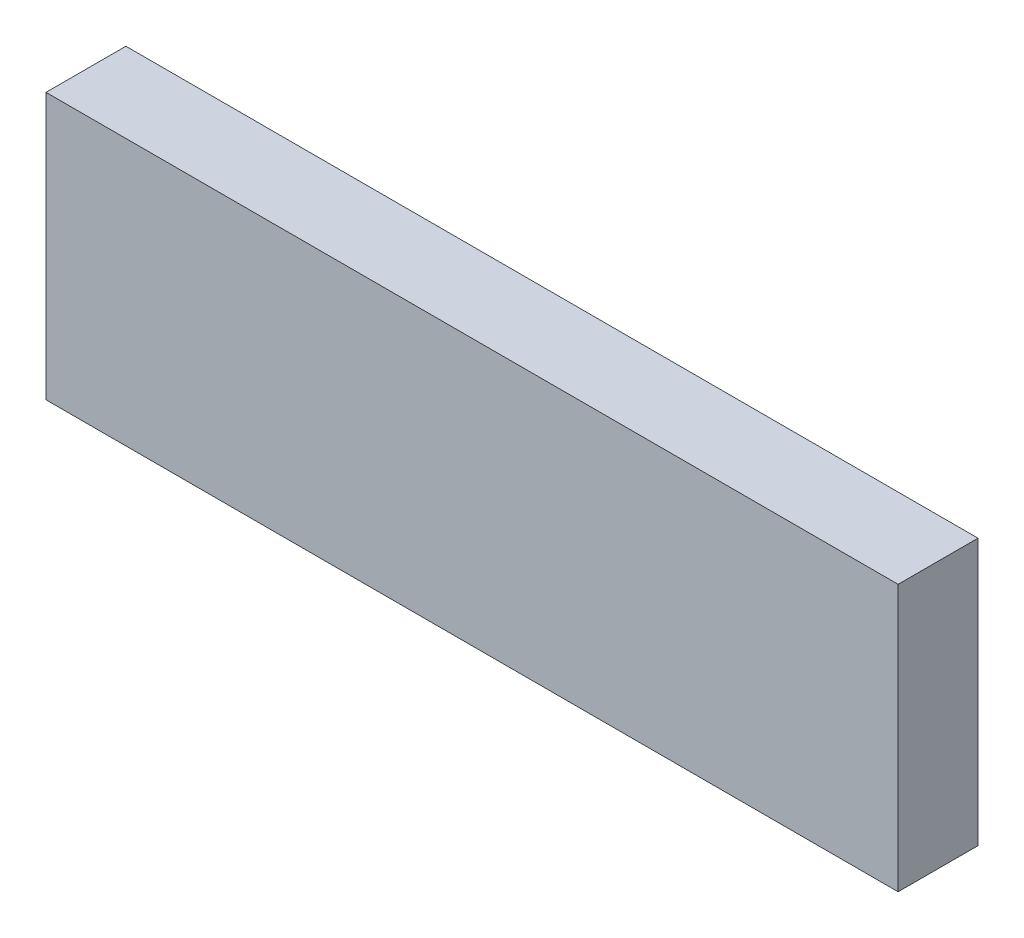
ISO-10303-21;
HEADER;
FILE_DESCRIPTION(('STEP AP214'),'2;1');
FILE_NAME('part.step','',(''),(''),'','','');
FILE_SCHEMA(('AUTOMOTIVE_DESIGN { 1 0 10303 214 1 1 1 1 }'));
ENDSEC;
DATA;
#1=APPLICATION_CONTEXT('core data for automotive mechanical design processes');
#2=APPLICATION_PROTOCOL_DEFINITION('international standard','automotive_design',2000,#1);
#3=PRODUCT_CONTEXT('',#1,'mechanical');
#4=PRODUCT('Part','Part','',(#3));
#5=PRODUCT_RELATED_PRODUCT_CATEGORY('part','',(#4));
#6=PRODUCT_DEFINITION_FORMATION('','',#4);
#7=PRODUCT_DEFINITION_CONTEXT('part definition',#1,'design');
#8=PRODUCT_DEFINITION('design','',#6,#7);
#9=PRODUCT_DEFINITION_SHAPE('','',#8);
#10=(LENGTH_UNIT() NAMED_UNIT(*) SI_UNIT(.MILLI.,.METRE.));
#11=(NAMED_UNIT(*) PLANE_ANGLE_UNIT() SI_UNIT($,.RADIAN.));
#12=(NAMED_UNIT(*) SI_UNIT($,.STERADIAN.) SOLID_ANGLE_UNIT());
#13=UNCERTAINTY_MEASURE_WITH_UNIT(LENGTH_MEASURE(1.E-05),#10,'distance_accuracy_value','');
#14=(GEOMETRIC_REPRESENTATION_CONTEXT(3) GLOBAL_UNCERTAINTY_ASSIGNED_CONTEXT((#13)) GLOBAL_UNIT_ASSIGNED_CONTEXT((#10,
#11,#12)) REPRESENTATION_CONTEXT('',''));
#15=CARTESIAN_POINT('',(0.,0.,0.));
#16=DIRECTION('',(0.,0.,1.));
#17=DIRECTION('',(1.,0.,0.));
#18=AXIS2_PLACEMENT_3D('',#15,#16,#17);
#19=CARTESIAN_POINT('',(-8.00000000000001,11.,-7.26305461424022));
#20=DIRECTION('',(0.,-1.,0.));
#21=DIRECTION('',(0.,0.,-1.));
#22=AXIS2_PLACEMENT_3D('',#19,#20,#21);
#23=PLANE('',#22);
#24=DIRECTION('',(1.,0.,0.));
#25=VECTOR('',#24,1.);
#26=CARTESIAN_POINT('',(-8.00000000000001,11.,9.5));
#27=LINE('',#26,#25);
#28=CARTESIAN_POINT('',(-8.00000000000001,11.,9.5));
#29=VERTEX_POINT('',#28);
#30=CARTESIAN_POINT('',(8.00000000000001,11.,9.49999999999999));
#31=VERTEX_POINT('',#30);
#32=EDGE_CURVE('E89',#29,#31,#27,.T.);
#33=ORIENTED_EDGE('',*,*,#32,.F.);
#34=DIRECTION('',(0.,0.,1.));
#35=VECTOR('',#34,1.);
#36=CARTESIAN_POINT('',(-8.00000000000001,11.,-7.26305461424022));
#37=LINE('',#36,#35);
#38=CARTESIAN_POINT('',(-8.00000000000001,11.,11.));
#39=VERTEX_POINT('',#38);
#40=EDGE_CURVE('E43',#29,#39,#37,.T.);
#41=ORIENTED_EDGE('',*,*,#40,.T.);
#42=DIRECTION('',(1.,0.,0.));
#43=VECTOR('',#42,1.);
#44=CARTESIAN_POINT('',(-8.00000000000001,11.,11.));
#45=LINE('',#44,#43);
#46=CARTESIAN_POINT('',(8.00000000000001,11.,11.));
#47=VERTEX_POINT('',#46);
#48=EDGE_CURVE('E87',#39,#47,#45,.T.);
#49=ORIENTED_EDGE('',*,*,#48,.T.);
#50=DIRECTION('',(0.,0.,1.));
#51=VECTOR('',#50,1.);
#52=CARTESIAN_POINT('',(8.00000000000001,11.,-7.26305461424022));
#53=LINE('',#52,#51);
#54=EDGE_CURVE('E78',#31,#47,#53,.T.);
#55=ORIENTED_EDGE('',*,*,#54,.F.);
#56=EDGE_LOOP('',(#33,#41,#49,#55));
#57=FACE_BOUND('',#56,.T.);
#58=ADVANCED_FACE('F39',(#57),#23,.F.);
#59=CARTESIAN_POINT('',(8.00000000000001,11.,-7.26305461424022));
#60=DIRECTION('',(-1.,0.,0.));
#61=DIRECTION('',(0.,-1.,0.));
#62=AXIS2_PLACEMENT_3D('',#59,#60,#61);
#63=PLANE('',#62);
#64=DIRECTION('',(0.,-1.,0.));
#65=VECTOR('',#64,1.);
#66=CARTESIAN_POINT('',(8.00000000000001,11.,9.5));
#67=LINE('',#66,#65);
#68=CARTESIAN_POINT('',(8.00000000000001,6.,9.49999999999999));
#69=VERTEX_POINT('',#68);
#70=EDGE_CURVE('E48',#31,#69,#67,.T.);
#71=ORIENTED_EDGE('',*,*,#70,.F.);
#72=ORIENTED_EDGE('',*,*,#54,.T.);
#73=DIRECTION('',(0.,-1.,0.));
#74=VECTOR('',#73,1.);
#75=CARTESIAN_POINT('',(8.00000000000001,11.,11.));
#76=LINE('',#75,#74);
#77=CARTESIAN_POINT('',(8.00000000000001,6.,11.));
#78=VERTEX_POINT('',#77);
#79=EDGE_CURVE('E99',#47,#78,#76,.T.);
#80=ORIENTED_EDGE('',*,*,#79,.T.);
#81=DIRECTION('',(0.,0.,1.));
#82=VECTOR('',#81,1.);
#83=CARTESIAN_POINT('',(8.00000000000001,6.,-7.26305461424022));
#84=LINE('',#83,#82);
#85=EDGE_CURVE('E108',#69,#78,#84,.T.);
#86=ORIENTED_EDGE('',*,*,#85,.F.);
#87=EDGE_LOOP('',(#71,#72,#80,#86));
#88=FACE_BOUND('',#87,.T.);
#89=ADVANCED_FACE('F112',(#88),#63,.F.);
#90=CARTESIAN_POINT('',(8.00000000000001,6.,-7.26305461424022));
#91=DIRECTION('',(0.,1.,0.));
#92=DIRECTION('',(0.,0.,1.));
#93=AXIS2_PLACEMENT_3D('',#90,#91,#92);
#94=PLANE('',#93);
#95=DIRECTION('',(-1.,0.,0.));
#96=VECTOR('',#95,1.);
#97=CARTESIAN_POINT('',(8.00000000000001,6.,9.5));
#98=LINE('',#97,#96);
#99=CARTESIAN_POINT('',(-8.00000000000001,6.,9.49999999999999));
#100=VERTEX_POINT('',#99);
#101=EDGE_CURVE('E11',#69,#100,#98,.T.);
#102=ORIENTED_EDGE('',*,*,#101,.F.);
#103=ORIENTED_EDGE('',*,*,#85,.T.);
#104=DIRECTION('',(-1.,0.,0.));
#105=VECTOR('',#104,1.);
#106=CARTESIAN_POINT('',(8.00000000000001,6.,11.));
#107=LINE('',#106,#105);
#108=CARTESIAN_POINT('',(-8.00000000000001,6.,11.));
#109=VERTEX_POINT('',#108);
#110=EDGE_CURVE('E109',#78,#109,#107,.T.);
#111=ORIENTED_EDGE('',*,*,#110,.T.);
#112=DIRECTION('',(0.,0.,1.));
#113=VECTOR('',#112,1.);
#114=CARTESIAN_POINT('',(-8.00000000000001,6.,-7.26305461424022));
#115=LINE('',#114,#113);
#116=EDGE_CURVE('E61',#100,#109,#115,.T.);
#117=ORIENTED_EDGE('',*,*,#116,.F.);
#118=EDGE_LOOP('',(#102,#103,#111,#117));
#119=FACE_BOUND('',#118,.T.);
#120=ADVANCED_FACE('F111',(#119),#94,.F.);
#121=CARTESIAN_POINT('',(-8.00000000000001,6.,-7.26305461424022));
#122=DIRECTION('',(1.,0.,0.));
#123=DIRECTION('',(0.,1.,0.));
#124=AXIS2_PLACEMENT_3D('',#121,#122,#123);
#125=PLANE('',#124);
#126=DIRECTION('',(0.,1.,0.));
#127=VECTOR('',#126,1.);
#128=CARTESIAN_POINT('',(-8.00000000000001,6.,9.5));
#129=LINE('',#128,#127);
#130=EDGE_CURVE('E96',#100,#29,#129,.T.);
#131=ORIENTED_EDGE('',*,*,#130,.F.);
#132=ORIENTED_EDGE('',*,*,#116,.T.);
#133=DIRECTION('',(0.,1.,0.));
#134=VECTOR('',#133,1.);
#135=CARTESIAN_POINT('',(-8.00000000000001,6.,11.));
#136=LINE('',#135,#134);
#137=EDGE_CURVE('E92',#109,#39,#136,.T.);
#138=ORIENTED_EDGE('',*,*,#137,.T.);
#139=ORIENTED_EDGE('',*,*,#40,.F.);
#140=EDGE_LOOP('',(#131,#132,#138,#139));
#141=FACE_BOUND('',#140,.T.);
#142=ADVANCED_FACE('F93',(#141),#125,.F.);
#143=CARTESIAN_POINT('',(0.,0.,11.));
#144=DIRECTION('',(0.,0.,-1.));
#145=DIRECTION('',(-1.,0.,0.));
#146=AXIS2_PLACEMENT_3D('',#143,#144,#145);
#147=PLANE('',#146);
#148=ORIENTED_EDGE('',*,*,#48,.F.);
#149=ORIENTED_EDGE('',*,*,#137,.F.);
#150=ORIENTED_EDGE('',*,*,#110,.F.);
#151=ORIENTED_EDGE('',*,*,#79,.F.);
#152=EDGE_LOOP('',(#148,#149,#150,#151));
#153=FACE_BOUND('',#152,.T.);
#154=ADVANCED_FACE('F98',(#153),#147,.F.);
#155=CARTESIAN_POINT('',(0.,0.,9.5));
#156=DIRECTION('',(0.,0.,-1.));
#157=DIRECTION('',(-1.,0.,0.));
#158=AXIS2_PLACEMENT_3D('',#155,#156,#157);
#159=PLANE('',#158);
#160=ORIENTED_EDGE('',*,*,#130,.T.);
#161=ORIENTED_EDGE('',*,*,#32,.T.);
#162=ORIENTED_EDGE('',*,*,#70,.T.);
#163=ORIENTED_EDGE('',*,*,#101,.T.);
#164=EDGE_LOOP('',(#160,#161,#162,#163));
#165=FACE_BOUND('',#164,.T.);
#166=ADVANCED_FACE('F41',(#165),#159,.T.);
#167=CLOSED_SHELL('',(#58,#89,#120,#142,#154,#166));
#168=MANIFOLD_SOLID_BREP('B2',#167);
#169=ADVANCED_BREP_SHAPE_REPRESENTATION('',(#18,#168),#14);
#170=SHAPE_DEFINITION_REPRESENTATION(#9,#169);
ENDSEC;
END-ISO-10303-21;
